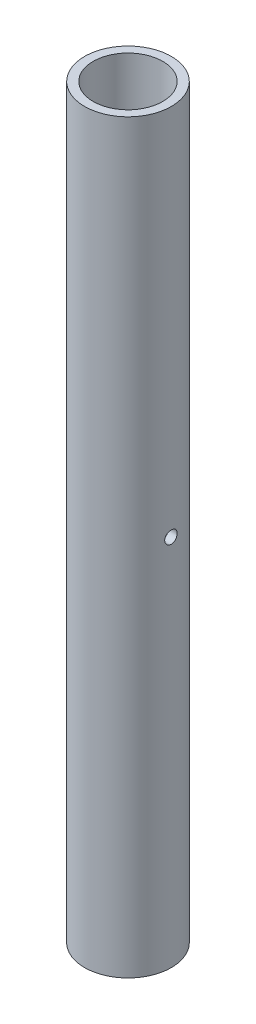
ISO-10303-21;
HEADER;
FILE_DESCRIPTION(('STEP AP214'),'2;1');
FILE_NAME('part.step','',(''),(''),'','','');
FILE_SCHEMA(('AUTOMOTIVE_DESIGN { 1 0 10303 214 1 1 1 1 }'));
ENDSEC;
DATA;
#1=APPLICATION_CONTEXT('core data for automotive mechanical design processes');
#2=APPLICATION_PROTOCOL_DEFINITION('international standard','automotive_design',2000,#1);
#3=PRODUCT_CONTEXT('',#1,'mechanical');
#4=PRODUCT('Part','Part','',(#3));
#5=PRODUCT_RELATED_PRODUCT_CATEGORY('part','',(#4));
#6=PRODUCT_DEFINITION_FORMATION('','',#4);
#7=PRODUCT_DEFINITION_CONTEXT('part definition',#1,'design');
#8=PRODUCT_DEFINITION('design','',#6,#7);
#9=PRODUCT_DEFINITION_SHAPE('','',#8);
#10=(LENGTH_UNIT() NAMED_UNIT(*) SI_UNIT(.MILLI.,.METRE.));
#11=(NAMED_UNIT(*) PLANE_ANGLE_UNIT() SI_UNIT($,.RADIAN.));
#12=(NAMED_UNIT(*) SI_UNIT($,.STERADIAN.) SOLID_ANGLE_UNIT());
#13=UNCERTAINTY_MEASURE_WITH_UNIT(LENGTH_MEASURE(1.E-05),#10,'distance_accuracy_value','');
#14=(GEOMETRIC_REPRESENTATION_CONTEXT(3) GLOBAL_UNCERTAINTY_ASSIGNED_CONTEXT((#13)) GLOBAL_UNIT_ASSIGNED_CONTEXT((#10,
#11,#12)) REPRESENTATION_CONTEXT('',''));
#15=CARTESIAN_POINT('',(0.,0.,0.));
#16=DIRECTION('',(0.,0.,1.));
#17=DIRECTION('',(1.,0.,0.));
#18=AXIS2_PLACEMENT_3D('',#15,#16,#17);
#19=CARTESIAN_POINT('',(0.,-300.,0.));
#20=DIRECTION('',(0.,1.,0.));
#21=DIRECTION('',(0.,0.,1.));
#22=AXIS2_PLACEMENT_3D('',#19,#20,#21);
#23=CYLINDRICAL_SURFACE('',#22,17.45);
#24=CARTESIAN_POINT('',(-17.45,-147.5,0.));
#25=CARTESIAN_POINT('',(-17.449997833609,-147.500005813199,-0.139659069131432));
#26=CARTESIAN_POINT('',(-17.4483057717418,-147.511742288432,-0.279400969536091));
#27=CARTESIAN_POINT('',(-17.4417186219199,-147.558369057046,-0.554983780799086));
#28=CARTESIAN_POINT('',(-17.436820350462,-147.59328236361,-0.690820674218131));
#29=CARTESIAN_POINT('',(-17.424371627989,-147.685202394939,-0.954564947499619));
#30=CARTESIAN_POINT('',(-17.4168231194134,-147.742192941777,-1.08247805438665));
#31=CARTESIAN_POINT('',(-17.3999095852699,-147.876611304284,-1.32690439029664));
#32=CARTESIAN_POINT('',(-17.3905448289335,-147.954036091495,-1.44341930508465));
#33=CARTESIAN_POINT('',(-17.3709664886444,-148.127715688061,-1.66259609430244));
#34=CARTESIAN_POINT('',(-17.3607478606969,-148.224087717809,-1.76516464040466));
#35=CARTESIAN_POINT('',(-17.3406532956682,-148.432674002354,-1.952732319487));
#36=CARTESIAN_POINT('',(-17.3307773776495,-148.544889136637,-2.03773047645087));
#37=CARTESIAN_POINT('',(-17.3124373449939,-148.782597741048,-2.18810364094725));
#38=CARTESIAN_POINT('',(-17.3039797459275,-148.908148384378,-2.25338913303157));
#39=CARTESIAN_POINT('',(-17.2895022578095,-149.168573913845,-2.3619118194634));
#40=CARTESIAN_POINT('',(-17.2834822476269,-149.303448336266,-2.4051501094291));
#41=CARTESIAN_POINT('',(-17.274610802817,-149.577714627511,-2.46806285751546));
#42=CARTESIAN_POINT('',(-17.2717379691438,-149.717069271071,-2.48789652617558));
#43=CARTESIAN_POINT('',(-17.2694210606716,-149.997156209543,-2.50393008582493));
#44=CARTESIAN_POINT('',(-17.2699768060186,-150.137888431803,-2.5001312165121));
#45=CARTESIAN_POINT('',(-17.2744346880879,-150.415615342819,-2.46913781028681));
#46=CARTESIAN_POINT('',(-17.278311541498,-150.552630221315,-2.44212003198173));
#47=CARTESIAN_POINT('',(-17.2889353425072,-150.820161499612,-2.3657321798732));
#48=CARTESIAN_POINT('',(-17.2956823647492,-150.950677730307,-2.31636152474837));
#49=CARTESIAN_POINT('',(-17.3113144307329,-151.202047878269,-2.19648377630887));
#50=CARTESIAN_POINT('',(-17.320207081256,-151.322865333184,-2.12590125806106));
#51=CARTESIAN_POINT('',(-17.3391228293591,-151.55100833164,-1.96565714417655));
#52=CARTESIAN_POINT('',(-17.3491459946886,-151.658333065772,-1.87599440481317));
#53=CARTESIAN_POINT('',(-17.3693053327107,-151.857468944192,-1.67916210556576));
#54=CARTESIAN_POINT('',(-17.3794417028889,-151.949129810444,-1.57184046156676));
#55=CARTESIAN_POINT('',(-17.3986003451384,-152.113161253329,-1.34325667458432));
#56=CARTESIAN_POINT('',(-17.4076226130734,-152.185531758345,-1.22199447984781));
#57=CARTESIAN_POINT('',(-17.4235447450989,-152.308933677292,-0.968845644712529));
#58=CARTESIAN_POINT('',(-17.4304435179015,-152.359954124017,-0.836953585293478));
#59=CARTESIAN_POINT('',(-17.441332047367,-152.439080265312,-0.566352842533648));
#60=CARTESIAN_POINT('',(-17.4453219832817,-152.467187371886,-0.42764457979095));
#61=CARTESIAN_POINT('',(-17.4499196708866,-152.499490598639,-0.148646527587752));
#62=CARTESIAN_POINT('',(-17.4505566616317,-152.503893437473,-0.00838113636609893));
#63=CARTESIAN_POINT('',(-17.4484560936687,-152.489210937023,0.270885813358843));
#64=CARTESIAN_POINT('',(-17.4457186300103,-152.470126259322,0.409887407348982));
#65=CARTESIAN_POINT('',(-17.4371948404663,-152.409182329122,0.682059503462013));
#66=CARTESIAN_POINT('',(-17.4314219183416,-152.367423174692,0.815252874942943));
#67=CARTESIAN_POINT('',(-17.417472688609,-152.262420809866,1.07274730483414));
#68=CARTESIAN_POINT('',(-17.4092962768242,-152.199176668204,1.19704797750807));
#69=CARTESIAN_POINT('',(-17.3913767332945,-152.052510284026,1.4341416626749));
#70=CARTESIAN_POINT('',(-17.3816235077272,-151.968956166961,1.54685232078544));
#71=CARTESIAN_POINT('',(-17.3616690380562,-151.784226070965,1.756724996173));
#72=CARTESIAN_POINT('',(-17.3514677703339,-151.683049162207,1.85388619249819));
#73=CARTESIAN_POINT('',(-17.3316749537202,-151.465027953172,2.03064872982674));
#74=CARTESIAN_POINT('',(-17.3220885907384,-151.348071112272,2.11011192971612));
#75=CARTESIAN_POINT('',(-17.3047009905486,-151.102348583748,2.2482642946866));
#76=CARTESIAN_POINT('',(-17.2968997085118,-150.973583192787,2.30695398147289));
#77=CARTESIAN_POINT('',(-17.2840025230464,-150.708320328084,2.4016764744555));
#78=CARTESIAN_POINT('',(-17.2788977708991,-150.571849791631,2.43778345894843));
#79=CARTESIAN_POINT('',(-17.2719475858838,-150.294703625582,2.48655255471416));
#80=CARTESIAN_POINT('',(-17.2701019493106,-150.15402825936,2.49921613127768));
#81=CARTESIAN_POINT('',(-17.269886110116,-149.873841768445,2.50070635732498));
#82=CARTESIAN_POINT('',(-17.2714842483363,-149.734331774152,2.48975014677459));
#83=CARTESIAN_POINT('',(-17.2779072977888,-149.459159594933,2.44477554758208));
#84=CARTESIAN_POINT('',(-17.2827322055965,-149.323497405924,2.41075718341444));
#85=CARTESIAN_POINT('',(-17.2950544454013,-149.059922974401,2.32069823101196));
#86=CARTESIAN_POINT('',(-17.3025500975677,-148.932005919428,2.26467148322988));
#87=CARTESIAN_POINT('',(-17.3193714878851,-148.687352519329,2.13220760960367));
#88=CARTESIAN_POINT('',(-17.3286972769633,-148.570616485472,2.05576991576417));
#89=CARTESIAN_POINT('',(-17.3482304425876,-148.350533509368,1.88386003361371));
#90=CARTESIAN_POINT('',(-17.3584448379142,-148.247313065403,1.78822668014984));
#91=CARTESIAN_POINT('',(-17.3785447310215,-148.05830683465,1.58098030031123));
#92=CARTESIAN_POINT('',(-17.3884301515271,-147.97252512032,1.46936355169146));
#93=CARTESIAN_POINT('',(-17.4068143220839,-147.820452382221,1.23266573312443));
#94=CARTESIAN_POINT('',(-17.4153058905528,-147.754260971436,1.10752012289331));
#95=CARTESIAN_POINT('',(-17.4298747133882,-147.643933813528,0.847828651271732));
#96=CARTESIAN_POINT('',(-17.4359545023606,-147.59977489919,0.713292834160886));
#97=CARTESIAN_POINT('',(-17.4436044333333,-147.544943940505,0.481771497795636));
#98=CARTESIAN_POINT('',(-17.445990637109,-147.528115272597,0.386224588665806));
#99=CARTESIAN_POINT('',(-17.4491891636135,-147.505641345889,0.193798407060499));
#100=CARTESIAN_POINT('',(-17.4500015034095,-147.499995965817,0.0969191490445922));
#101=CARTESIAN_POINT('',(-17.45,-147.5,0.));
#102=B_SPLINE_CURVE_WITH_KNOTS('',3,(#24,#25,#26,#27,#28,#29,#30,#31,#32,#33,#34,#35,#36,#37,
#38,#39,#40,#41,#42,#43,#44,#45,#46,#47,#48,#49,#50,#51,#52,#53,#54,#55,#56,#57,#58,#59,#60,#61,
#62,#63,#64,#65,#66,#67,#68,#69,#70,#71,#72,#73,#74,#75,#76,#77,#78,#79,#80,#81,#82,#83,#84,#85,
#86,#87,#88,#89,#90,#91,#92,#93,#94,#95,#96,#97,#98,#99,#100,#101),.UNSPECIFIED.,.T.,.F.,(4,2,2,
2,2,2,2,2,2,2,2,2,2,2,2,2,2,2,2,2,2,2,2,2,2,2,2,2,2,2,2,2,2,2,2,2,2,2,4),(0.,0.41862309503204,
0.83766248030086,1.25639537779091,1.67506625177179,2.09641379298885,2.51778473332338,
2.94104130268848,3.36427683660443,3.78461639191028,4.20493389754503,4.62207971265908,
5.03923637692287,5.45789427521329,5.87657727620848,6.29907548903479,6.72157527039904,
7.14429181797616,7.5669823142385,7.98598059515674,8.40496707423131,8.8221187705194,
9.23928855053353,9.65924301665748,10.0792196474539,10.502367670737,10.9255050663433,
11.347245163796,11.7689589002042,12.1868123067866,12.6046652699271,13.0222558767089,
13.4398581054042,13.8611253415745,14.2824908433322,14.7059634829881,15.1289898969107,
15.4195047512123,15.7100164551299),.UNSPECIFIED.);
#103=CARTESIAN_POINT('',(-17.45,-147.5,0.));
#104=VERTEX_POINT('',#103);
#105=EDGE_CURVE('E10',#104,#104,#102,.T.);
#106=ORIENTED_EDGE('',*,*,#105,.F.);
#107=EDGE_LOOP('',(#106));
#108=FACE_BOUND('',#107,.T.);
#109=CARTESIAN_POINT('',(17.2699884192202,-150.,-2.49999999999999));
#110=CARTESIAN_POINT('',(17.2699906700957,-149.860349222677,-2.49999417964548));
#111=CARTESIAN_POINT('',(17.2717006294794,-149.720615591199,-2.48825905096343));
#112=CARTESIAN_POINT('',(17.2783516696973,-149.445049957514,-2.44163811644041));
#113=CARTESIAN_POINT('',(17.2832959665398,-149.30922197931,-2.40672926769443));
#114=CARTESIAN_POINT('',(17.2958444371735,-149.045496567665,-2.3148222739143));
#115=CARTESIAN_POINT('',(17.3034466370928,-148.917593331724,-2.25784051778013));
#116=CARTESIAN_POINT('',(17.3204519870499,-148.673183572525,-2.12344286428692));
#117=CARTESIAN_POINT('',(17.3298548719862,-148.556675375468,-2.0460299742197));
#118=CARTESIAN_POINT('',(17.349479042744,-148.337491154421,-1.87236246009536));
#119=CARTESIAN_POINT('',(17.3597052775671,-148.234910550387,-1.77598795200908));
#120=CARTESIAN_POINT('',(17.3797796495088,-148.047319555247,-1.56739162749959));
#121=CARTESIAN_POINT('',(17.3896277663983,-147.962310103123,-1.45516896470933));
#122=CARTESIAN_POINT('',(17.4078877863405,-147.811925004667,-1.21745361153159));
#123=CARTESIAN_POINT('',(17.4162932212316,-147.746636832864,-1.091905043242));
#124=CARTESIAN_POINT('',(17.4306661084296,-147.638108621911,-0.831484018550048));
#125=CARTESIAN_POINT('',(17.4366336784989,-147.594867517738,-0.696612012890191));
#126=CARTESIAN_POINT('',(17.4454235522337,-147.531949069658,-0.422353743869622));
#127=CARTESIAN_POINT('',(17.4482671389467,-147.512112208106,-0.283004769062737));
#128=CARTESIAN_POINT('',(17.4505615218279,-147.496070297873,-0.00292897602711557));
#129=CARTESIAN_POINT('',(17.4500124908175,-147.499864045439,0.137797771652669));
#130=CARTESIAN_POINT('',(17.4456005650384,-147.53084921913,0.415546937899425));
#131=CARTESIAN_POINT('',(17.4417619746957,-147.557869047242,0.55258894034812));
#132=CARTESIAN_POINT('',(17.4312293445286,-147.634270352877,0.820173403317904));
#133=CARTESIAN_POINT('',(17.424535236532,-147.683652364273,0.950715708582961));
#134=CARTESIAN_POINT('',(17.4090018733181,-147.803553876838,1.2021179425556));
#135=CARTESIAN_POINT('',(17.4001552485319,-147.874146195007,1.32294266871781));
#136=CARTESIAN_POINT('',(17.381303911319,-148.034411360172,1.5510960785885));
#137=CARTESIAN_POINT('',(17.3712991292824,-148.124085354326,1.65842395027141));
#138=CARTESIAN_POINT('',(17.3511423946113,-148.320925793909,1.8575475802696));
#139=CARTESIAN_POINT('',(17.3409899269637,-148.428241987036,1.9491953186531));
#140=CARTESIAN_POINT('',(17.3217699334829,-148.656810135681,2.113202849021));
#141=CARTESIAN_POINT('',(17.3127024132685,-148.778062163362,2.18556254111899));
#142=CARTESIAN_POINT('',(17.2966792278577,-149.031207921804,2.30895661523192));
#143=CARTESIAN_POINT('',(17.2897249744946,-149.163108692649,2.35997674922329));
#144=CARTESIAN_POINT('',(17.2787413803952,-149.433728418079,2.43909961050927));
#145=CARTESIAN_POINT('',(17.274711852449,-149.572446935657,2.46720380465313));
#146=CARTESIAN_POINT('',(17.270069125874,-149.851450263159,2.49949601568935));
#147=CARTESIAN_POINT('',(17.269426017722,-149.9917103579,2.50389342382887));
#148=CARTESIAN_POINT('',(17.2715496287525,-150.270965422381,2.48920195223855));
#149=CARTESIAN_POINT('',(17.2743162517158,-150.40996042771,2.47011373524992));
#150=CARTESIAN_POINT('',(17.2829201759858,-150.682097157463,2.40917008643165));
#151=CARTESIAN_POINT('',(17.2887435169935,-150.815262535084,2.36741813253414));
#152=CARTESIAN_POINT('',(17.3027932836378,-151.072704150661,2.26243951038766));
#153=CARTESIAN_POINT('',(17.3110198182981,-151.196979985016,2.19921186784844));
#154=CARTESIAN_POINT('',(17.3290198614878,-151.434055924846,2.05257022421394));
#155=CARTESIAN_POINT('',(17.3388036359795,-151.546771082754,1.96902016971505));
#156=CARTESIAN_POINT('',(17.3587844941479,-151.756654720722,1.78429542601091));
#157=CARTESIAN_POINT('',(17.3689815990636,-151.853822400601,1.68311983023359));
#158=CARTESIAN_POINT('',(17.388733193526,-152.030600125836,1.46509597037583));
#159=CARTESIAN_POINT('',(17.3982822360595,-152.110071737777,1.34813489628501));
#160=CARTESIAN_POINT('',(17.4155780950753,-152.248238846435,1.10240154531826));
#161=CARTESIAN_POINT('',(17.4233249572759,-152.306934870215,0.973629568180571));
#162=CARTESIAN_POINT('',(17.4361196462015,-152.401661310504,0.70836991073948));
#163=CARTESIAN_POINT('',(17.4411766237855,-152.437768647463,0.571910159295782));
#164=CARTESIAN_POINT('',(17.4480600592334,-152.486542098361,0.294786834398609));
#165=CARTESIAN_POINT('',(17.4498867109459,-152.499209618901,0.15412351371231));
#166=CARTESIAN_POINT('',(17.4501020348807,-152.500711829836,-0.126068842496564));
#167=CARTESIAN_POINT('',(17.4485213287242,-152.489758795662,-0.265596763190459));
#168=CARTESIAN_POINT('',(17.4421610263954,-152.444784263737,-0.540805614619156));
#169=CARTESIAN_POINT('',(17.4373814379203,-152.410762821493,-0.676486554609853));
#170=CARTESIAN_POINT('',(17.4251578684848,-152.320690116899,-0.940100311878777));
#171=CARTESIAN_POINT('',(17.4177155107067,-152.264652273365,-1.06803779401928));
#172=CARTESIAN_POINT('',(17.4009857409017,-152.132159849092,-1.31272745268777));
#173=CARTESIAN_POINT('',(17.3916982796454,-152.055704723577,-1.42947933064808));
#174=CARTESIAN_POINT('',(17.372212619974,-151.883775093156,-1.64956275965082));
#175=CARTESIAN_POINT('',(17.3620073087598,-151.78814344541,-1.75277093088838));
#176=CARTESIAN_POINT('',(17.3418900445272,-151.580905603635,-1.94175319343922));
#177=CARTESIAN_POINT('',(17.3319781610562,-151.469295658483,-2.027523179426));
#178=CARTESIAN_POINT('',(17.3135159357748,-151.232603940265,-2.17958261066714));
#179=CARTESIAN_POINT('',(17.3049727931516,-151.107456384792,-2.24577050884667));
#180=CARTESIAN_POINT('',(17.290299637642,-150.847760914935,-2.35609056867585));
#181=CARTESIAN_POINT('',(17.2841670872327,-150.713223061984,-2.40024593625507));
#182=CARTESIAN_POINT('',(17.276447204345,-150.481711104173,-2.45506739474629));
#183=CARTESIAN_POINT('',(17.2740377744681,-150.386176270582,-2.47189179342364));
#184=CARTESIAN_POINT('',(17.2708076098865,-150.193774246926,-2.4943600525109));
#185=CARTESIAN_POINT('',(17.269986857283,-150.096907071884,-2.50000403888558));
#186=CARTESIAN_POINT('',(17.2699884192202,-150.,-2.49999999999999));
#187=B_SPLINE_CURVE_WITH_KNOTS('',3,(#109,#110,#111,#112,#113,#114,#115,#116,#117,#118,#119,
#120,#121,#122,#123,#124,#125,#126,#127,#128,#129,#130,#131,#132,#133,#134,#135,#136,#137,#138,
#139,#140,#141,#142,#143,#144,#145,#146,#147,#148,#149,#150,#151,#152,#153,#154,#155,#156,#157,
#158,#159,#160,#161,#162,#163,#164,#165,#166,#167,#168,#169,#170,#171,#172,#173,#174,#175,#176,
#177,#178,#179,#180,#181,#182,#183,#184,#185,#186),.UNSPECIFIED.,.T.,.F.,(4,2,2,2,2,2,2,2,2,2,2,
2,2,2,2,2,2,2,2,2,2,2,2,2,2,2,2,2,2,2,2,2,2,2,2,2,2,2,4),(0.,0.418598182334508,
0.837613224602607,1.2563177471328,1.67496067420168,2.09634082539993,2.51774348882404,
2.94098874445321,3.3642135525394,3.78453678587649,4.20483860794368,4.62206160336463,
5.03929456007133,5.45797660961436,5.87668383673078,6.29914833494593,6.72161502092214,
7.14436333144327,7.56708457972127,7.98606593142509,8.40503546015905,8.82210795656634,
9.23919937688134,9.65916392960751,10.0791500896483,10.5023145282642,10.9254682307419,
11.3471730254977,11.7688525133091,12.186758214375,12.6046629098682,13.0223132900462,
13.4399748151014,13.8612100865011,14.2825444112704,14.706026825732,15.1290622576303,
15.4195409929497,15.7100164555548),.UNSPECIFIED.);
#188=CARTESIAN_POINT('',(17.2699884192202,-150.,-2.49999999999999));
#189=VERTEX_POINT('',#188);
#190=EDGE_CURVE('E48',#189,#189,#187,.T.);
#191=ORIENTED_EDGE('',*,*,#190,.F.);
#192=EDGE_LOOP('',(#191));
#193=FACE_BOUND('',#192,.T.);
#194=CARTESIAN_POINT('',(0.,-300.,0.));
#195=DIRECTION('',(0.,1.,0.));
#196=DIRECTION('',(0.,0.,1.));
#197=AXIS2_PLACEMENT_3D('',#194,#195,#196);
#198=CIRCLE('',#197,17.45);
#199=CARTESIAN_POINT('',(0.,-300.,17.45));
#200=VERTEX_POINT('',#199);
#201=EDGE_CURVE('E52',#200,#200,#198,.T.);
#202=ORIENTED_EDGE('',*,*,#201,.T.);
#203=EDGE_LOOP('',(#202));
#204=FACE_BOUND('',#203,.T.);
#205=CARTESIAN_POINT('',(0.,0.,0.));
#206=DIRECTION('',(0.,1.,0.));
#207=DIRECTION('',(0.,0.,1.));
#208=AXIS2_PLACEMENT_3D('',#205,#206,#207);
#209=CIRCLE('',#208,17.45);
#210=CARTESIAN_POINT('',(0.,0.,17.45));
#211=VERTEX_POINT('',#210);
#212=EDGE_CURVE('E56',#211,#211,#209,.T.);
#213=ORIENTED_EDGE('',*,*,#212,.F.);
#214=EDGE_LOOP('',(#213));
#215=FACE_BOUND('',#214,.T.);
#216=ADVANCED_FACE('F37',(#108,#193,#204,#215),#23,.T.);
#217=CARTESIAN_POINT('',(0.,-300.,0.));
#218=DIRECTION('',(0.,1.,0.));
#219=DIRECTION('',(0.,0.,1.));
#220=AXIS2_PLACEMENT_3D('',#217,#218,#219);
#221=PLANE('',#220);
#222=CARTESIAN_POINT('',(0.,-300.,0.));
#223=DIRECTION('',(0.,1.,0.));
#224=DIRECTION('',(0.,0.,1.));
#225=AXIS2_PLACEMENT_3D('',#222,#223,#224);
#226=CIRCLE('',#225,14.);
#227=CARTESIAN_POINT('',(0.,-300.,14.));
#228=VERTEX_POINT('',#227);
#229=EDGE_CURVE('E87',#228,#228,#226,.T.);
#230=ORIENTED_EDGE('',*,*,#229,.T.);
#231=EDGE_LOOP('',(#230));
#232=FACE_BOUND('',#231,.T.);
#233=ORIENTED_EDGE('',*,*,#201,.F.);
#234=EDGE_LOOP('',(#233));
#235=FACE_BOUND('',#234,.T.);
#236=ADVANCED_FACE('F97',(#232,#235),#221,.F.);
#237=CARTESIAN_POINT('',(0.,0.,0.));
#238=DIRECTION('',(0.,1.,0.));
#239=DIRECTION('',(0.,0.,1.));
#240=AXIS2_PLACEMENT_3D('',#237,#238,#239);
#241=PLANE('',#240);
#242=CARTESIAN_POINT('',(0.,0.,0.));
#243=DIRECTION('',(0.,1.,0.));
#244=DIRECTION('',(0.,0.,1.));
#245=AXIS2_PLACEMENT_3D('',#242,#243,#244);
#246=CIRCLE('',#245,14.);
#247=CARTESIAN_POINT('',(0.,0.,14.));
#248=VERTEX_POINT('',#247);
#249=EDGE_CURVE('E86',#248,#248,#246,.T.);
#250=ORIENTED_EDGE('',*,*,#249,.F.);
#251=EDGE_LOOP('',(#250));
#252=FACE_BOUND('',#251,.T.);
#253=ORIENTED_EDGE('',*,*,#212,.T.);
#254=EDGE_LOOP('',(#253));
#255=FACE_BOUND('',#254,.T.);
#256=ADVANCED_FACE('F94',(#252,#255),#241,.T.);
#257=CARTESIAN_POINT('',(0.,-300.,0.));
#258=DIRECTION('',(0.,1.,0.));
#259=DIRECTION('',(0.,0.,1.));
#260=AXIS2_PLACEMENT_3D('',#257,#258,#259);
#261=CYLINDRICAL_SURFACE('',#260,14.);
#262=CARTESIAN_POINT('',(-13.7749773139559,-150.,-2.49999999999999));
#263=CARTESIAN_POINT('',(-13.7749799387038,-150.139219633012,-2.4999945411629));
#264=CARTESIAN_POINT('',(-13.7771107908789,-150.27851154187,-2.4883313115394));
#265=CARTESIAN_POINT('',(-13.7853946199968,-150.553176265414,-2.44201304135069));
#266=CARTESIAN_POINT('',(-13.7915511402329,-150.688545517757,-2.40733774573405));
#267=CARTESIAN_POINT('',(-13.8071672988197,-150.951350660636,-2.31608691728921));
#268=CARTESIAN_POINT('',(-13.8166239998033,-151.07879348773,-2.25953085486463));
#269=CARTESIAN_POINT('',(-13.8377715156682,-151.322371087812,-2.12617418313794));
#270=CARTESIAN_POINT('',(-13.8494621222548,-151.43850691357,-2.04937546105772));
#271=CARTESIAN_POINT('',(-13.873907770039,-151.657496927778,-1.87678833540928));
#272=CARTESIAN_POINT('',(-13.8866723857643,-151.760204817065,-1.78081562712206));
#273=CARTESIAN_POINT('',(-13.9117430255489,-151.948150528926,-1.57300318552243));
#274=CARTESIAN_POINT('',(-13.9240490207841,-152.033387254952,-1.46116245702622));
#275=CARTESIAN_POINT('',(-13.9469179106052,-152.184526710267,-1.22383338523176));
#276=CARTESIAN_POINT('',(-13.9574682193538,-152.250292271137,-1.09825637183168));
#277=CARTESIAN_POINT('',(-13.9755301011882,-152.359739742686,-0.837616772802044));
#278=CARTESIAN_POINT('',(-13.9830419008821,-152.403423300271,-0.702554895423173));
#279=CARTESIAN_POINT('',(-13.9941127759412,-152.467016490045,-0.428293673644152));
#280=CARTESIAN_POINT('',(-13.997712773247,-152.487172417043,-0.28915311684408));
#281=CARTESIAN_POINT('',(-14.0006952718093,-152.503904927246,-0.00942173772766852));
#282=CARTESIAN_POINT('',(-14.0000781001693,-152.500483339233,0.131168971263461));
#283=CARTESIAN_POINT('',(-13.9947279617152,-152.470348245803,0.408122988432862));
#284=CARTESIAN_POINT('',(-13.9900418473477,-152.443899876401,0.544516181052064));
#285=CARTESIAN_POINT('',(-13.9771327520065,-152.368880512089,0.810897015102341));
#286=CARTESIAN_POINT('',(-13.9689096512162,-152.320308767739,0.940884439369605));
#287=CARTESIAN_POINT('',(-13.9497715520927,-152.202164014084,1.19154151829011));
#288=CARTESIAN_POINT('',(-13.9388428375475,-152.132483577918,1.31215944836133));
#289=CARTESIAN_POINT('',(-13.9155046200703,-151.974178361061,1.54009014093526));
#290=CARTESIAN_POINT('',(-13.9030949801311,-151.885551826977,1.64740167052526));
#291=CARTESIAN_POINT('',(-13.8779680889456,-151.690404888012,1.8472424092631));
#292=CARTESIAN_POINT('',(-13.8652489602259,-151.583652612162,1.93954509991399));
#293=CARTESIAN_POINT('',(-13.8411025662894,-151.356060791827,2.10496786240998));
#294=CARTESIAN_POINT('',(-13.8296753166704,-151.235221077289,2.17808770266065));
#295=CARTESIAN_POINT('',(-13.8094045266784,-150.982600952103,2.30312479829603));
#296=CARTESIAN_POINT('',(-13.8005646973667,-150.850805171754,2.3550116418329));
#297=CARTESIAN_POINT('',(-13.7865283348087,-150.580174187589,2.43584403060096));
#298=CARTESIAN_POINT('',(-13.7813314298779,-150.441339703476,2.46479191631385));
#299=CARTESIAN_POINT('',(-13.7752421770154,-150.162607904559,2.49859916205465));
#300=CARTESIAN_POINT('',(-13.7742918793935,-150.02275115305,2.50378283673312));
#301=CARTESIAN_POINT('',(-13.776648684601,-149.744169662984,2.49078161816557));
#302=CARTESIAN_POINT('',(-13.7799555974406,-149.605444874188,2.47259776776006));
#303=CARTESIAN_POINT('',(-13.7904004323731,-149.334115417732,2.4136552586584));
#304=CARTESIAN_POINT('',(-13.7975098617234,-149.201473097393,2.37306442666377));
#305=CARTESIAN_POINT('',(-13.8147344144981,-148.944872687796,2.27063733511701));
#306=CARTESIAN_POINT('',(-13.824849741264,-148.820915186745,2.2087996382238));
#307=CARTESIAN_POINT('',(-13.847079502443,-148.583767873532,2.06487935022984));
#308=CARTESIAN_POINT('',(-13.8592138527616,-148.470705091531,1.98259057596104));
#309=CARTESIAN_POINT('',(-13.8840574336727,-148.259875744834,1.80038422344424));
#310=CARTESIAN_POINT('',(-13.896766710884,-148.162110423433,1.70046521371052));
#311=CARTESIAN_POINT('',(-13.9215130679047,-147.983451685284,1.48439134339208));
#312=CARTESIAN_POINT('',(-13.9335402120035,-147.902775580385,1.36805548621629));
#313=CARTESIAN_POINT('',(-13.9554035273845,-147.762113937578,1.12329296566844));
#314=CARTESIAN_POINT('',(-13.9652397773074,-147.702127656978,0.994866736508674));
#315=CARTESIAN_POINT('',(-13.9815700956849,-147.604879481443,0.730189348324158));
#316=CARTESIAN_POINT('',(-13.9880802890981,-147.567507783422,0.593979571421844));
#317=CARTESIAN_POINT('',(-13.9970934930076,-147.51619771652,0.317090343286913));
#318=CARTESIAN_POINT('',(-13.9995968842815,-147.502257120909,0.176411318075575));
#319=CARTESIAN_POINT('',(-14.0003078168069,-147.498276573053,-0.103333169371389));
#320=CARTESIAN_POINT('',(-13.9985745411226,-147.507907348864,-0.242393904292866));
#321=CARTESIAN_POINT('',(-13.9911289095657,-147.550078966739,-0.51688255605542));
#322=CARTESIAN_POINT('',(-13.9854165844658,-147.582619631626,-0.652310500982765));
#323=CARTESIAN_POINT('',(-13.9706535216891,-147.669553936971,-0.915536497496649));
#324=CARTESIAN_POINT('',(-13.9616076667541,-147.723915625728,-1.04334539246557));
#325=CARTESIAN_POINT('',(-13.9411603934573,-147.85291069311,-1.28807790386464));
#326=CARTESIAN_POINT('',(-13.9297588372901,-147.927545257753,-1.40500088290236));
#327=CARTESIAN_POINT('',(-13.9056730650892,-148.096115988713,-1.6262914777391));
#328=CARTESIAN_POINT('',(-13.892974041367,-148.190291518827,-1.7304751643583));
#329=CARTESIAN_POINT('',(-13.8678219751628,-148.394771371964,-1.9216755089612));
#330=CARTESIAN_POINT('',(-13.8553689910715,-148.50507947263,-2.00868813488377));
#331=CARTESIAN_POINT('',(-13.8320070537405,-148.739781161184,-2.16374622415779));
#332=CARTESIAN_POINT('',(-13.8211117157455,-148.86428365262,-2.23162894316815));
#333=CARTESIAN_POINT('',(-13.8022610834653,-149.123075067656,-2.34540886935922));
#334=CARTESIAN_POINT('',(-13.7943029436204,-149.257354367638,-2.39132736832843));
#335=CARTESIAN_POINT('',(-13.7839341813702,-149.493406735213,-2.45025798781185));
#336=CARTESIAN_POINT('',(-13.7805947327216,-149.593775865911,-2.46888019081667));
#337=CARTESIAN_POINT('',(-13.7761153629215,-149.796083761968,-2.49375305438022));
#338=CARTESIAN_POINT('',(-13.7749753913445,-149.898022491287,-2.50000399856394));
#339=CARTESIAN_POINT('',(-13.7749773139559,-150.,-2.49999999999999));
#340=B_SPLINE_CURVE_WITH_KNOTS('',3,(#262,#263,#264,#265,#266,#267,#268,#269,#270,#271,#272,
#273,#274,#275,#276,#277,#278,#279,#280,#281,#282,#283,#284,#285,#286,#287,#288,#289,#290,#291,
#292,#293,#294,#295,#296,#297,#298,#299,#300,#301,#302,#303,#304,#305,#306,#307,#308,#309,#310,
#311,#312,#313,#314,#315,#316,#317,#318,#319,#320,#321,#322,#323,#324,#325,#326,#327,#328,#329,
#330,#331,#332,#333,#334,#335,#336,#337,#338,#339),.UNSPECIFIED.,.T.,.F.,(4,2,2,2,2,2,2,2,2,2,2,
2,2,2,2,2,2,2,2,2,2,2,2,2,2,2,2,2,2,2,2,2,2,2,2,2,2,2,4),(0.,0.41728583600933,0.83493945195107,
1.25222227420762,1.66946620696472,2.09093251520212,2.512425267948,2.93682027279777,
3.36118362098867,3.78106358503934,4.20091098159993,4.61598714610602,5.03107737256275,
5.44831662439173,5.86559450693786,6.28867984623346,6.71177029320065,7.13546462585337,
7.55911572303871,7.97696761802823,8.39480086586728,8.8095462197338,9.2243196364675,
9.64345757488929,10.0626295608598,10.4868484189541,10.9110520475064,11.333179112111,
11.7552660584073,12.1714905473979,12.5877118174953,13.003325840844,13.4189641839515,
13.8400311188066,14.2611968100938,14.6858441972247,15.110079099029,15.4157453666601,
15.7214046264677),.UNSPECIFIED.);
#341=CARTESIAN_POINT('',(-13.7749773139559,-150.,-2.49999999999999));
#342=VERTEX_POINT('',#341);
#343=EDGE_CURVE('E80',#342,#342,#340,.T.);
#344=ORIENTED_EDGE('',*,*,#343,.T.);
#345=EDGE_LOOP('',(#344));
#346=FACE_BOUND('',#345,.T.);
#347=CARTESIAN_POINT('',(13.7749773139559,-150.,-2.49999999999999));
#348=CARTESIAN_POINT('',(13.7749799387038,-149.860780366988,-2.4999945411629));
#349=CARTESIAN_POINT('',(13.7771107908789,-149.72148845813,-2.48833131153941));
#350=CARTESIAN_POINT('',(13.7853946199968,-149.446823734586,-2.4420130413507));
#351=CARTESIAN_POINT('',(13.7915511402329,-149.311454482243,-2.40733774573405));
#352=CARTESIAN_POINT('',(13.8071672988197,-149.048649339364,-2.31608691728921));
#353=CARTESIAN_POINT('',(13.8166239998033,-148.92120651227,-2.25953085486463));
#354=CARTESIAN_POINT('',(13.8377715156682,-148.677628912188,-2.12617418313794));
#355=CARTESIAN_POINT('',(13.8494621222548,-148.56149308643,-2.04937546105772));
#356=CARTESIAN_POINT('',(13.873907770039,-148.342503072222,-1.87678833540928));
#357=CARTESIAN_POINT('',(13.8866723857643,-148.239795182935,-1.78081562712206));
#358=CARTESIAN_POINT('',(13.9117430255489,-148.051849471074,-1.57300318552243));
#359=CARTESIAN_POINT('',(13.9240490207841,-147.966612745048,-1.46116245702622));
#360=CARTESIAN_POINT('',(13.9469179106052,-147.815473289733,-1.22383338523176));
#361=CARTESIAN_POINT('',(13.9574682193538,-147.749707728863,-1.09825637183168));
#362=CARTESIAN_POINT('',(13.9755301011882,-147.640260257314,-0.837616772802044));
#363=CARTESIAN_POINT('',(13.9830419008821,-147.596576699729,-0.702554895423173));
#364=CARTESIAN_POINT('',(13.9941127759412,-147.532983509955,-0.428293673644151));
#365=CARTESIAN_POINT('',(13.997712773247,-147.512827582957,-0.289153116844078));
#366=CARTESIAN_POINT('',(14.0006952718093,-147.496095072754,-0.00942173772766627));
#367=CARTESIAN_POINT('',(14.0000781001693,-147.499516660767,0.131168971263463));
#368=CARTESIAN_POINT('',(13.9947279617152,-147.529651754197,0.408122988432862));
#369=CARTESIAN_POINT('',(13.9900418473477,-147.556100123599,0.544516181052064));
#370=CARTESIAN_POINT('',(13.9771327520065,-147.631119487911,0.810897015102341));
#371=CARTESIAN_POINT('',(13.9689096512162,-147.679691232261,0.940884439369605));
#372=CARTESIAN_POINT('',(13.9497715520927,-147.797835985916,1.19154151829011));
#373=CARTESIAN_POINT('',(13.9388428375475,-147.867516422082,1.31215944836133));
#374=CARTESIAN_POINT('',(13.9155046200703,-148.025821638939,1.54009014093526));
#375=CARTESIAN_POINT('',(13.9030949801311,-148.114448173023,1.64740167052526));
#376=CARTESIAN_POINT('',(13.8779680889456,-148.309595111988,1.8472424092631));
#377=CARTESIAN_POINT('',(13.8652489602259,-148.416347387838,1.93954509991399));
#378=CARTESIAN_POINT('',(13.8411025662894,-148.643939208173,2.10496786240998));
#379=CARTESIAN_POINT('',(13.8296753166704,-148.764778922711,2.17808770266065));
#380=CARTESIAN_POINT('',(13.8094045266784,-149.017399047897,2.30312479829603));
#381=CARTESIAN_POINT('',(13.8005646973667,-149.149194828246,2.3550116418329));
#382=CARTESIAN_POINT('',(13.7865283348087,-149.419825812411,2.43584403060096));
#383=CARTESIAN_POINT('',(13.7813314298779,-149.558660296524,2.46479191631385));
#384=CARTESIAN_POINT('',(13.7752421770154,-149.837392095441,2.49859916205465));
#385=CARTESIAN_POINT('',(13.7742918793935,-149.97724884695,2.50378283673312));
#386=CARTESIAN_POINT('',(13.776648684601,-150.255830337016,2.49078161816557));
#387=CARTESIAN_POINT('',(13.7799555974406,-150.394555125812,2.47259776776006));
#388=CARTESIAN_POINT('',(13.7904004323731,-150.665884582268,2.4136552586584));
#389=CARTESIAN_POINT('',(13.7975098617234,-150.798526902607,2.37306442666377));
#390=CARTESIAN_POINT('',(13.8147344144981,-151.055127312204,2.27063733511701));
#391=CARTESIAN_POINT('',(13.824849741264,-151.179084813255,2.2087996382238));
#392=CARTESIAN_POINT('',(13.847079502443,-151.416232126468,2.06487935022983));
#393=CARTESIAN_POINT('',(13.8592138527616,-151.529294908469,1.98259057596103));
#394=CARTESIAN_POINT('',(13.8840574336727,-151.740124255166,1.80038422344423));
#395=CARTESIAN_POINT('',(13.896766710884,-151.837889576567,1.70046521371052));
#396=CARTESIAN_POINT('',(13.9215130679047,-152.016548314716,1.48439134339208));
#397=CARTESIAN_POINT('',(13.9335402120035,-152.097224419615,1.36805548621629));
#398=CARTESIAN_POINT('',(13.9554035273845,-152.237886062422,1.12329296566844));
#399=CARTESIAN_POINT('',(13.9652397773074,-152.297872343022,0.994866736508674));
#400=CARTESIAN_POINT('',(13.9815700956849,-152.395120518557,0.730189348324158));
#401=CARTESIAN_POINT('',(13.9880802890981,-152.432492216578,0.593979571421844));
#402=CARTESIAN_POINT('',(13.9970934930076,-152.48380228348,0.317090343286913));
#403=CARTESIAN_POINT('',(13.9995968842815,-152.497742879091,0.176411318075575));
#404=CARTESIAN_POINT('',(14.0003078168069,-152.501723426947,-0.103333169371389));
#405=CARTESIAN_POINT('',(13.9985745411226,-152.492092651136,-0.242393904292866));
#406=CARTESIAN_POINT('',(13.9911289095657,-152.449921033261,-0.51688255605542));
#407=CARTESIAN_POINT('',(13.9854165844658,-152.417380368374,-0.652310500982765));
#408=CARTESIAN_POINT('',(13.9706535216891,-152.330446063029,-0.915536497496649));
#409=CARTESIAN_POINT('',(13.9616076667541,-152.276084374272,-1.04334539246557));
#410=CARTESIAN_POINT('',(13.9411603934573,-152.14708930689,-1.28807790386464));
#411=CARTESIAN_POINT('',(13.9297588372901,-152.072454742247,-1.40500088290236));
#412=CARTESIAN_POINT('',(13.9056730650892,-151.903884011287,-1.62629147773911));
#413=CARTESIAN_POINT('',(13.892974041367,-151.809708481173,-1.73047516435832));
#414=CARTESIAN_POINT('',(13.8678219751628,-151.605228628036,-1.92167550896122));
#415=CARTESIAN_POINT('',(13.8553689910715,-151.49492052737,-2.00868813488378));
#416=CARTESIAN_POINT('',(13.8320070537405,-151.260218838816,-2.16374622415779));
#417=CARTESIAN_POINT('',(13.8211117157455,-151.13571634738,-2.23162894316815));
#418=CARTESIAN_POINT('',(13.8022610834653,-150.876924932344,-2.34540886935923));
#419=CARTESIAN_POINT('',(13.7943029436204,-150.742645632362,-2.39132736832843));
#420=CARTESIAN_POINT('',(13.7839341813702,-150.506593264787,-2.45025798781185));
#421=CARTESIAN_POINT('',(13.7805947327216,-150.406224134089,-2.46888019081667));
#422=CARTESIAN_POINT('',(13.7761153629215,-150.203916238032,-2.49375305438022));
#423=CARTESIAN_POINT('',(13.7749753913445,-150.101977508713,-2.50000399856394));
#424=CARTESIAN_POINT('',(13.7749773139559,-150.,-2.49999999999999));
#425=B_SPLINE_CURVE_WITH_KNOTS('',3,(#347,#348,#349,#350,#351,#352,#353,#354,#355,#356,#357,
#358,#359,#360,#361,#362,#363,#364,#365,#366,#367,#368,#369,#370,#371,#372,#373,#374,#375,#376,
#377,#378,#379,#380,#381,#382,#383,#384,#385,#386,#387,#388,#389,#390,#391,#392,#393,#394,#395,
#396,#397,#398,#399,#400,#401,#402,#403,#404,#405,#406,#407,#408,#409,#410,#411,#412,#413,#414,
#415,#416,#417,#418,#419,#420,#421,#422,#423,#424),.UNSPECIFIED.,.T.,.F.,(4,2,2,2,2,2,2,2,2,2,2,
2,2,2,2,2,2,2,2,2,2,2,2,2,2,2,2,2,2,2,2,2,2,2,2,2,2,2,4),(0.,0.417285836009302,0.83493945195107,
1.25222227420762,1.66946620696472,2.09093251520212,2.512425267948,2.93682027279777,
3.36118362098867,3.78106358503934,4.20091098159993,4.61598714610602,5.03107737256275,
5.44831662439173,5.86559450693786,6.28867984623346,6.71177029320065,7.13546462585337,
7.55911572303871,7.97696761802823,8.39480086586728,8.8095462197338,9.2243196364675,
9.6434575748893,10.0626295608598,10.4868484189541,10.9110520475064,11.333179112111,
11.7552660584073,12.1714905473979,12.5877118174953,13.003325840844,13.4189641839515,
13.8400311188066,14.2611968100938,14.6858441972248,15.110079099029,15.4157453666601,
15.7214046264677),.UNSPECIFIED.);
#426=CARTESIAN_POINT('',(13.7749773139559,-150.,-2.49999999999999));
#427=VERTEX_POINT('',#426);
#428=EDGE_CURVE('E75',#427,#427,#425,.T.);
#429=ORIENTED_EDGE('',*,*,#428,.T.);
#430=EDGE_LOOP('',(#429));
#431=FACE_BOUND('',#430,.T.);
#432=ORIENTED_EDGE('',*,*,#229,.F.);
#433=EDGE_LOOP('',(#432));
#434=FACE_BOUND('',#433,.T.);
#435=ORIENTED_EDGE('',*,*,#249,.T.);
#436=EDGE_LOOP('',(#435));
#437=FACE_BOUND('',#436,.T.);
#438=ADVANCED_FACE('F67',(#346,#431,#434,#437),#261,.F.);
#439=CARTESIAN_POINT('',(17.45,-150.,0.));
#440=DIRECTION('',(1.,0.,0.));
#441=DIRECTION('',(0.,0.,-1.));
#442=AXIS2_PLACEMENT_3D('',#439,#440,#441);
#443=CYLINDRICAL_SURFACE('',#442,2.49999999999999);
#444=ORIENTED_EDGE('',*,*,#190,.T.);
#445=EDGE_LOOP('',(#444));
#446=FACE_BOUND('',#445,.T.);
#447=ORIENTED_EDGE('',*,*,#428,.F.);
#448=EDGE_LOOP('',(#447));
#449=FACE_BOUND('',#448,.T.);
#450=ADVANCED_FACE('F66',(#446,#449),#443,.F.);
#451=ORIENTED_EDGE('',*,*,#105,.T.);
#452=EDGE_LOOP('',(#451));
#453=FACE_BOUND('',#452,.T.);
#454=ORIENTED_EDGE('',*,*,#343,.F.);
#455=EDGE_LOOP('',(#454));
#456=FACE_BOUND('',#455,.T.);
#457=ADVANCED_FACE('F62',(#453,#456),#443,.F.);
#458=CLOSED_SHELL('',(#216,#236,#256,#438,#450,#457));
#459=MANIFOLD_SOLID_BREP('B2',#458);
#460=ADVANCED_BREP_SHAPE_REPRESENTATION('',(#18,#459),#14);
#461=SHAPE_DEFINITION_REPRESENTATION(#9,#460);
ENDSEC;
END-ISO-10303-21;
